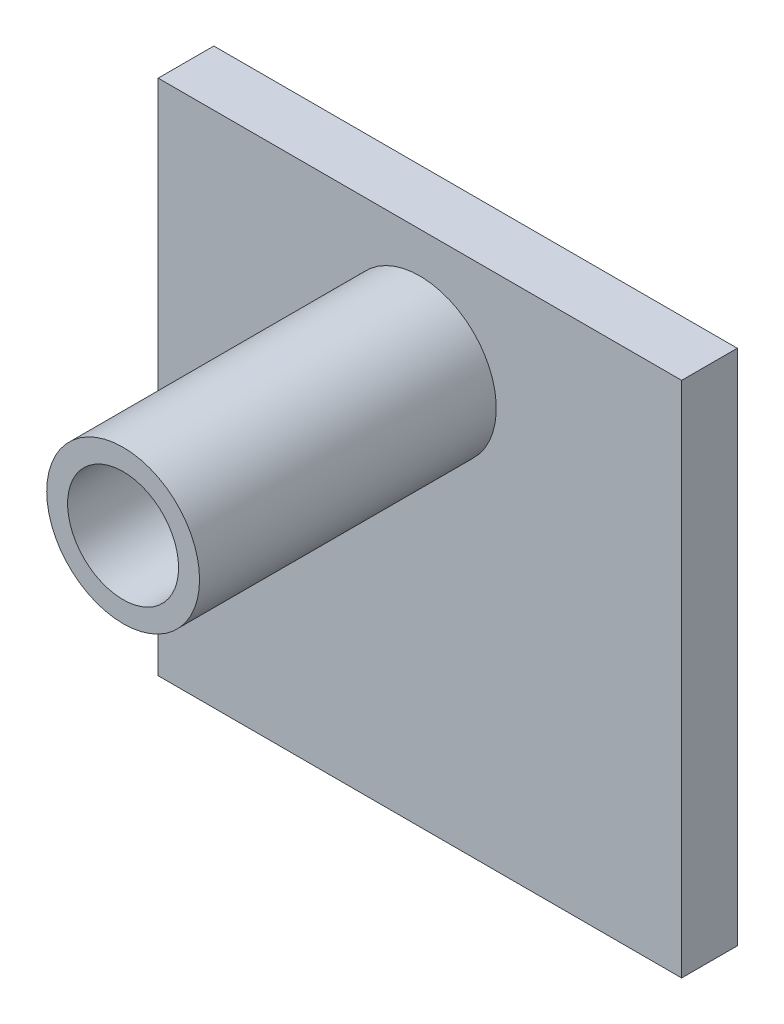
ISO-10303-21;
HEADER;
FILE_DESCRIPTION(('STEP AP214'),'2;1');
FILE_NAME('part.step','',(''),(''),'','','');
FILE_SCHEMA(('AUTOMOTIVE_DESIGN { 1 0 10303 214 1 1 1 1 }'));
ENDSEC;
DATA;
#1=APPLICATION_CONTEXT('core data for automotive mechanical design processes');
#2=APPLICATION_PROTOCOL_DEFINITION('international standard','automotive_design',2000,#1);
#3=PRODUCT_CONTEXT('',#1,'mechanical');
#4=PRODUCT('Part','Part','',(#3));
#5=PRODUCT_RELATED_PRODUCT_CATEGORY('part','',(#4));
#6=PRODUCT_DEFINITION_FORMATION('','',#4);
#7=PRODUCT_DEFINITION_CONTEXT('part definition',#1,'design');
#8=PRODUCT_DEFINITION('design','',#6,#7);
#9=PRODUCT_DEFINITION_SHAPE('','',#8);
#10=(LENGTH_UNIT() NAMED_UNIT(*) SI_UNIT(.MILLI.,.METRE.));
#11=(NAMED_UNIT(*) PLANE_ANGLE_UNIT() SI_UNIT($,.RADIAN.));
#12=(NAMED_UNIT(*) SI_UNIT($,.STERADIAN.) SOLID_ANGLE_UNIT());
#13=UNCERTAINTY_MEASURE_WITH_UNIT(LENGTH_MEASURE(1.E-05),#10,'distance_accuracy_value','');
#14=(GEOMETRIC_REPRESENTATION_CONTEXT(3) GLOBAL_UNCERTAINTY_ASSIGNED_CONTEXT((#13)) GLOBAL_UNIT_ASSIGNED_CONTEXT((#10,
#11,#12)) REPRESENTATION_CONTEXT('',''));
#15=CARTESIAN_POINT('',(0.,0.,0.));
#16=DIRECTION('',(0.,0.,1.));
#17=DIRECTION('',(1.,0.,0.));
#18=AXIS2_PLACEMENT_3D('',#15,#16,#17);
#19=CARTESIAN_POINT('',(0.,0.,6.));
#20=DIRECTION('',(0.,0.,-1.));
#21=DIRECTION('',(-1.,0.,0.));
#22=AXIS2_PLACEMENT_3D('',#19,#20,#21);
#23=PLANE('',#22);
#24=CARTESIAN_POINT('',(-0.00665117853148982,15.3032735223465,6.));
#25=DIRECTION('',(0.,0.,-1.));
#26=DIRECTION('',(-1.,0.,0.));
#27=AXIS2_PLACEMENT_3D('',#24,#25,#26);
#28=CIRCLE('',#27,8.24052596159078);
#29=CARTESIAN_POINT('',(-8.24717714012227,15.3032735223465,6.));
#30=VERTEX_POINT('',#29);
#31=EDGE_CURVE('E11',#30,#30,#28,.F.);
#32=ORIENTED_EDGE('',*,*,#31,.F.);
#33=EDGE_LOOP('',(#32));
#34=FACE_BOUND('',#33,.T.);
#35=DIRECTION('',(0.,1.,0.));
#36=VECTOR('',#35,1.);
#37=CARTESIAN_POINT('',(28.2258332010092,-27.9096667195963,6.));
#38=LINE('',#37,#36);
#39=CARTESIAN_POINT('',(28.2258332010092,-27.9096667195963,6.));
#40=VERTEX_POINT('',#39);
#41=CARTESIAN_POINT('',(28.2258332010092,27.9096667195963,6.));
#42=VERTEX_POINT('',#41);
#43=EDGE_CURVE('E94',#40,#42,#38,.T.);
#44=ORIENTED_EDGE('',*,*,#43,.T.);
#45=DIRECTION('',(-1.,0.,0.));
#46=VECTOR('',#45,1.);
#47=CARTESIAN_POINT('',(-28.2258332010092,27.9096667195963,6.));
#48=LINE('',#47,#46);
#49=CARTESIAN_POINT('',(-28.2258332010092,27.9096667195963,6.));
#50=VERTEX_POINT('',#49);
#51=EDGE_CURVE('E89',#42,#50,#48,.T.);
#52=ORIENTED_EDGE('',*,*,#51,.T.);
#53=DIRECTION('',(0.,-1.,0.));
#54=VECTOR('',#53,1.);
#55=CARTESIAN_POINT('',(-28.2258332010092,-27.9096667195963,6.));
#56=LINE('',#55,#54);
#57=CARTESIAN_POINT('',(-28.2258332010092,-27.9096667195963,6.));
#58=VERTEX_POINT('',#57);
#59=EDGE_CURVE('E91',#50,#58,#56,.T.);
#60=ORIENTED_EDGE('',*,*,#59,.T.);
#61=DIRECTION('',(1.,0.,0.));
#62=VECTOR('',#61,1.);
#63=CARTESIAN_POINT('',(-28.2258332010092,-27.9096667195963,6.));
#64=LINE('',#63,#62);
#65=EDGE_CURVE('E61',#58,#40,#64,.T.);
#66=ORIENTED_EDGE('',*,*,#65,.T.);
#67=EDGE_LOOP('',(#44,#52,#60,#66));
#68=FACE_BOUND('',#67,.T.);
#69=ADVANCED_FACE('F39',(#34,#68),#23,.F.);
#70=CARTESIAN_POINT('',(0.,0.,0.));
#71=DIRECTION('',(0.,0.,-1.));
#72=DIRECTION('',(-1.,0.,0.));
#73=AXIS2_PLACEMENT_3D('',#70,#71,#72);
#74=PLANE('',#73);
#75=DIRECTION('',(0.,1.,0.));
#76=VECTOR('',#75,1.);
#77=CARTESIAN_POINT('',(28.2258332010092,-27.9096667195963,0.));
#78=LINE('',#77,#76);
#79=CARTESIAN_POINT('',(28.2258332010092,-27.9096667195963,0.));
#80=VERTEX_POINT('',#79);
#81=CARTESIAN_POINT('',(28.2258332010092,27.9096667195963,0.));
#82=VERTEX_POINT('',#81);
#83=EDGE_CURVE('E115',#80,#82,#78,.T.);
#84=ORIENTED_EDGE('',*,*,#83,.F.);
#85=DIRECTION('',(1.,0.,0.));
#86=VECTOR('',#85,1.);
#87=CARTESIAN_POINT('',(-28.2258332010092,-27.9096667195963,0.));
#88=LINE('',#87,#86);
#89=CARTESIAN_POINT('',(-28.2258332010092,-27.9096667195963,0.));
#90=VERTEX_POINT('',#89);
#91=EDGE_CURVE('E81',#90,#80,#88,.T.);
#92=ORIENTED_EDGE('',*,*,#91,.F.);
#93=DIRECTION('',(0.,-1.,0.));
#94=VECTOR('',#93,1.);
#95=CARTESIAN_POINT('',(-28.2258332010092,-27.9096667195963,0.));
#96=LINE('',#95,#94);
#97=CARTESIAN_POINT('',(-28.2258332010092,27.9096667195963,0.));
#98=VERTEX_POINT('',#97);
#99=EDGE_CURVE('E122',#98,#90,#96,.T.);
#100=ORIENTED_EDGE('',*,*,#99,.F.);
#101=DIRECTION('',(-1.,0.,0.));
#102=VECTOR('',#101,1.);
#103=CARTESIAN_POINT('',(-28.2258332010092,27.9096667195963,0.));
#104=LINE('',#103,#102);
#105=EDGE_CURVE('E101',#82,#98,#104,.T.);
#106=ORIENTED_EDGE('',*,*,#105,.F.);
#107=EDGE_LOOP('',(#84,#92,#100,#106));
#108=FACE_BOUND('',#107,.T.);
#109=CARTESIAN_POINT('',(0.,15.26895552,0.));
#110=DIRECTION('',(0.,0.,1.));
#111=DIRECTION('',(1.,0.,0.));
#112=AXIS2_PLACEMENT_3D('',#109,#110,#111);
#113=CIRCLE('',#112,6.00822744591539);
#114=CARTESIAN_POINT('',(6.00822744591539,15.26895552,0.));
#115=VERTEX_POINT('',#114);
#116=EDGE_CURVE('E119',#115,#115,#113,.T.);
#117=ORIENTED_EDGE('',*,*,#116,.T.);
#118=EDGE_LOOP('',(#117));
#119=FACE_BOUND('',#118,.T.);
#120=ADVANCED_FACE('F134',(#108,#119),#74,.T.);
#121=CARTESIAN_POINT('',(28.2258332010092,-27.9096667195963,6.));
#122=DIRECTION('',(-1.,0.,0.));
#123=DIRECTION('',(0.,0.,1.));
#124=AXIS2_PLACEMENT_3D('',#121,#122,#123);
#125=PLANE('',#124);
#126=ORIENTED_EDGE('',*,*,#83,.T.);
#127=DIRECTION('',(0.,0.,-1.));
#128=VECTOR('',#127,1.);
#129=CARTESIAN_POINT('',(28.2258332010092,27.9096667195963,6.));
#130=LINE('',#129,#128);
#131=EDGE_CURVE('E48',#42,#82,#130,.T.);
#132=ORIENTED_EDGE('',*,*,#131,.F.);
#133=ORIENTED_EDGE('',*,*,#43,.F.);
#134=DIRECTION('',(0.,0.,-1.));
#135=VECTOR('',#134,1.);
#136=CARTESIAN_POINT('',(28.2258332010092,-27.9096667195963,6.));
#137=LINE('',#136,#135);
#138=EDGE_CURVE('E111',#40,#80,#137,.T.);
#139=ORIENTED_EDGE('',*,*,#138,.T.);
#140=EDGE_LOOP('',(#126,#132,#133,#139));
#141=FACE_BOUND('',#140,.T.);
#142=ADVANCED_FACE('F41',(#141),#125,.F.);
#143=CARTESIAN_POINT('',(-28.2258332010092,27.9096667195963,6.));
#144=DIRECTION('',(0.,-1.,0.));
#145=DIRECTION('',(0.,0.,-1.));
#146=AXIS2_PLACEMENT_3D('',#143,#144,#145);
#147=PLANE('',#146);
#148=ORIENTED_EDGE('',*,*,#105,.T.);
#149=DIRECTION('',(0.,0.,-1.));
#150=VECTOR('',#149,1.);
#151=CARTESIAN_POINT('',(-28.2258332010092,27.9096667195963,6.));
#152=LINE('',#151,#150);
#153=EDGE_CURVE('E99',#50,#98,#152,.T.);
#154=ORIENTED_EDGE('',*,*,#153,.F.);
#155=ORIENTED_EDGE('',*,*,#51,.F.);
#156=ORIENTED_EDGE('',*,*,#131,.T.);
#157=EDGE_LOOP('',(#148,#154,#155,#156));
#158=FACE_BOUND('',#157,.T.);
#159=ADVANCED_FACE('F100',(#158),#147,.F.);
#160=CARTESIAN_POINT('',(-28.2258332010092,-27.9096667195963,6.));
#161=DIRECTION('',(1.,0.,0.));
#162=DIRECTION('',(0.,0.,-1.));
#163=AXIS2_PLACEMENT_3D('',#160,#161,#162);
#164=PLANE('',#163);
#165=ORIENTED_EDGE('',*,*,#99,.T.);
#166=DIRECTION('',(0.,0.,-1.));
#167=VECTOR('',#166,1.);
#168=CARTESIAN_POINT('',(-28.2258332010092,-27.9096667195963,6.));
#169=LINE('',#168,#167);
#170=EDGE_CURVE('E105',#58,#90,#169,.T.);
#171=ORIENTED_EDGE('',*,*,#170,.F.);
#172=ORIENTED_EDGE('',*,*,#59,.F.);
#173=ORIENTED_EDGE('',*,*,#153,.T.);
#174=EDGE_LOOP('',(#165,#171,#172,#173));
#175=FACE_BOUND('',#174,.T.);
#176=ADVANCED_FACE('F107',(#175),#164,.F.);
#177=CARTESIAN_POINT('',(-28.2258332010092,-27.9096667195963,6.));
#178=DIRECTION('',(0.,1.,0.));
#179=DIRECTION('',(0.,0.,1.));
#180=AXIS2_PLACEMENT_3D('',#177,#178,#179);
#181=PLANE('',#180);
#182=ORIENTED_EDGE('',*,*,#91,.T.);
#183=ORIENTED_EDGE('',*,*,#138,.F.);
#184=ORIENTED_EDGE('',*,*,#65,.F.);
#185=ORIENTED_EDGE('',*,*,#170,.T.);
#186=EDGE_LOOP('',(#182,#183,#184,#185));
#187=FACE_BOUND('',#186,.T.);
#188=ADVANCED_FACE('F136',(#187),#181,.F.);
#189=CARTESIAN_POINT('',(0.,15.26895552,6.));
#190=DIRECTION('',(0.,0.,-1.));
#191=DIRECTION('',(-1.,0.,0.));
#192=AXIS2_PLACEMENT_3D('',#189,#190,#191);
#193=CYLINDRICAL_SURFACE('',#192,6.00822744591539);
#194=CARTESIAN_POINT('',(0.,15.26895552,6.));
#195=DIRECTION('',(0.,0.,1.));
#196=DIRECTION('',(1.,0.,0.));
#197=AXIS2_PLACEMENT_3D('',#194,#195,#196);
#198=CIRCLE('',#197,6.00822744591539);
#199=CARTESIAN_POINT('',(-2.993150448627,20.4785473882499,6.));
#200=VERTEX_POINT('',#199);
#201=EDGE_CURVE('E142',#200,#200,#198,.T.);
#202=ORIENTED_EDGE('',*,*,#201,.T.);
#203=EDGE_LOOP('',(#202));
#204=FACE_BOUND('',#203,.T.);
#205=ORIENTED_EDGE('',*,*,#116,.F.);
#206=EDGE_LOOP('',(#205));
#207=FACE_BOUND('',#206,.T.);
#208=ADVANCED_FACE('F179',(#204,#207),#193,.F.);
#209=CARTESIAN_POINT('',(-0.00665117853148982,15.3032735223465,6.));
#210=DIRECTION('',(0.,0.,1.));
#211=DIRECTION('',(1.,0.,0.));
#212=AXIS2_PLACEMENT_3D('',#209,#210,#211);
#213=PLANE('',#212);
#214=ORIENTED_EDGE('',*,*,#201,.F.);
#215=CARTESIAN_POINT('',(-0.012037356103543,15.2899065926402,6.));
#216=DIRECTION('',(0.,0.,1.));
#217=DIRECTION('',(1.,0.,0.));
#218=AXIS2_PLACEMENT_3D('',#215,#216,#217);
#219=CIRCLE('',#218,5.9840645531511);
#220=EDGE_CURVE('E53',#200,#200,#219,.T.);
#221=ORIENTED_EDGE('',*,*,#220,.T.);
#222=EDGE_LOOP('',(#214,#221));
#223=FACE_BOUND('',#222,.T.);
#224=ADVANCED_FACE('F168',(#223),#213,.F.);
#225=CARTESIAN_POINT('',(-0.00665117853148982,15.3032735223465,38.));
#226=DIRECTION('',(0.,0.,-1.));
#227=DIRECTION('',(-1.,0.,0.));
#228=AXIS2_PLACEMENT_3D('',#225,#226,#227);
#229=CYLINDRICAL_SURFACE('',#228,8.24052596159078);
#230=CARTESIAN_POINT('',(-0.00665117853148982,15.3032735223465,38.));
#231=DIRECTION('',(0.,0.,1.));
#232=DIRECTION('',(1.,0.,0.));
#233=AXIS2_PLACEMENT_3D('',#230,#231,#232);
#234=CIRCLE('',#233,8.24052596159078);
#235=CARTESIAN_POINT('',(8.23387478305929,15.3032735223465,38.));
#236=VERTEX_POINT('',#235);
#237=EDGE_CURVE('E146',#236,#236,#234,.T.);
#238=ORIENTED_EDGE('',*,*,#237,.F.);
#239=EDGE_LOOP('',(#238));
#240=FACE_BOUND('',#239,.T.);
#241=ORIENTED_EDGE('',*,*,#31,.T.);
#242=EDGE_LOOP('',(#241));
#243=FACE_BOUND('',#242,.T.);
#244=ADVANCED_FACE('F162',(#240,#243),#229,.T.);
#245=CARTESIAN_POINT('',(-0.00665117853148982,15.3032735223465,38.));
#246=DIRECTION('',(0.,0.,1.));
#247=DIRECTION('',(1.,0.,0.));
#248=AXIS2_PLACEMENT_3D('',#245,#246,#247);
#249=PLANE('',#248);
#250=CARTESIAN_POINT('',(-0.012037356103543,15.2899065926402,38.));
#251=DIRECTION('',(0.,0.,1.));
#252=DIRECTION('',(1.,0.,0.));
#253=AXIS2_PLACEMENT_3D('',#250,#251,#252);
#254=CIRCLE('',#253,5.9840645531511);
#255=CARTESIAN_POINT('',(5.97202719704756,15.2899065926402,38.));
#256=VERTEX_POINT('',#255);
#257=EDGE_CURVE('E150',#256,#256,#254,.T.);
#258=ORIENTED_EDGE('',*,*,#257,.F.);
#259=EDGE_LOOP('',(#258));
#260=FACE_BOUND('',#259,.T.);
#261=ORIENTED_EDGE('',*,*,#237,.T.);
#262=EDGE_LOOP('',(#261));
#263=FACE_BOUND('',#262,.T.);
#264=ADVANCED_FACE('F159',(#260,#263),#249,.T.);
#265=CARTESIAN_POINT('',(-0.012037356103543,15.2899065926402,38.));
#266=DIRECTION('',(0.,0.,-1.));
#267=DIRECTION('',(-1.,0.,0.));
#268=AXIS2_PLACEMENT_3D('',#265,#266,#267);
#269=CYLINDRICAL_SURFACE('',#268,5.9840645531511);
#270=ORIENTED_EDGE('',*,*,#257,.T.);
#271=EDGE_LOOP('',(#270));
#272=FACE_BOUND('',#271,.T.);
#273=ORIENTED_EDGE('',*,*,#220,.F.);
#274=EDGE_LOOP('',(#273));
#275=FACE_BOUND('',#274,.T.);
#276=ADVANCED_FACE('F157',(#272,#275),#269,.F.);
#277=CLOSED_SHELL('',(#69,#120,#142,#159,#176,#188,#208,#224,#244,#264,#276));
#278=MANIFOLD_SOLID_BREP('B2',#277);
#279=ADVANCED_BREP_SHAPE_REPRESENTATION('',(#18,#278),#14);
#280=SHAPE_DEFINITION_REPRESENTATION(#9,#279);
ENDSEC;
END-ISO-10303-21;
